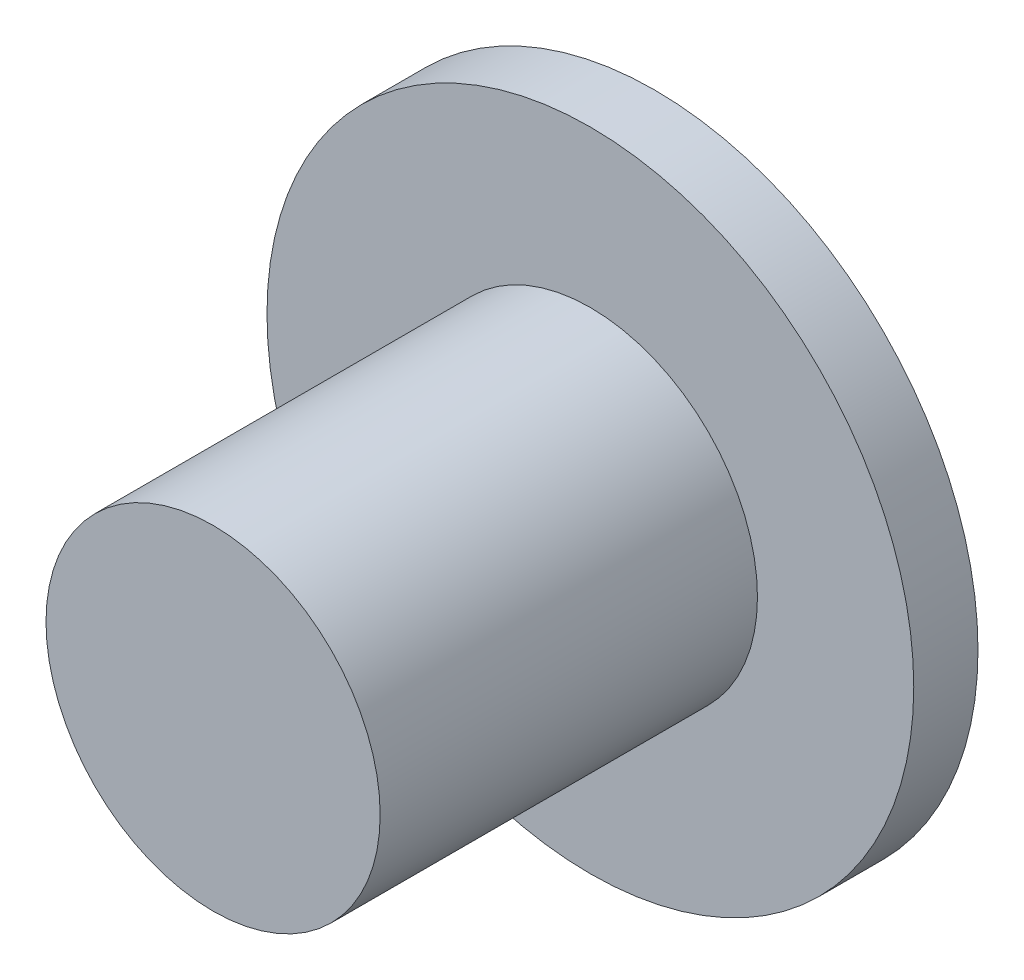
ISO-10303-21;
HEADER;
FILE_DESCRIPTION(('STEP AP214'),'2;1');
FILE_NAME('part.step','',(''),(''),'','','');
FILE_SCHEMA(('AUTOMOTIVE_DESIGN { 1 0 10303 214 1 1 1 1 }'));
ENDSEC;
DATA;
#1=APPLICATION_CONTEXT('core data for automotive mechanical design processes');
#2=APPLICATION_PROTOCOL_DEFINITION('international standard','automotive_design',2000,#1);
#3=PRODUCT_CONTEXT('',#1,'mechanical');
#4=PRODUCT('Part','Part','',(#3));
#5=PRODUCT_RELATED_PRODUCT_CATEGORY('part','',(#4));
#6=PRODUCT_DEFINITION_FORMATION('','',#4);
#7=PRODUCT_DEFINITION_CONTEXT('part definition',#1,'design');
#8=PRODUCT_DEFINITION('design','',#6,#7);
#9=PRODUCT_DEFINITION_SHAPE('','',#8);
#10=(LENGTH_UNIT() NAMED_UNIT(*) SI_UNIT(.MILLI.,.METRE.));
#11=(NAMED_UNIT(*) PLANE_ANGLE_UNIT() SI_UNIT($,.RADIAN.));
#12=(NAMED_UNIT(*) SI_UNIT($,.STERADIAN.) SOLID_ANGLE_UNIT());
#13=UNCERTAINTY_MEASURE_WITH_UNIT(LENGTH_MEASURE(1.E-05),#10,'distance_accuracy_value','');
#14=(GEOMETRIC_REPRESENTATION_CONTEXT(3) GLOBAL_UNCERTAINTY_ASSIGNED_CONTEXT((#13)) GLOBAL_UNIT_ASSIGNED_CONTEXT((#10,
#11,#12)) REPRESENTATION_CONTEXT('',''));
#15=CARTESIAN_POINT('',(0.,0.,0.));
#16=DIRECTION('',(0.,0.,1.));
#17=DIRECTION('',(1.,0.,0.));
#18=AXIS2_PLACEMENT_3D('',#15,#16,#17);
#19=CARTESIAN_POINT('',(0.,0.,0.2));
#20=DIRECTION('',(0.,0.,-1.));
#21=DIRECTION('',(-1.,0.,0.));
#22=AXIS2_PLACEMENT_3D('',#19,#20,#21);
#23=PLANE('',#22);
#24=CARTESIAN_POINT('',(0.,0.,0.2));
#25=DIRECTION('',(0.,0.,-1.));
#26=DIRECTION('',(-1.,0.,0.));
#27=AXIS2_PLACEMENT_3D('',#24,#25,#26);
#28=CIRCLE('',#27,1.15);
#29=CARTESIAN_POINT('',(-1.15,0.,0.2));
#30=VERTEX_POINT('',#29);
#31=EDGE_CURVE('E51',#30,#30,#28,.T.);
#32=ORIENTED_EDGE('',*,*,#31,.T.);
#33=EDGE_LOOP('',(#32));
#34=FACE_BOUND('',#33,.T.);
#35=CARTESIAN_POINT('',(0.,0.,0.2));
#36=DIRECTION('',(0.,0.,-1.));
#37=DIRECTION('',(-1.,0.,0.));
#38=AXIS2_PLACEMENT_3D('',#35,#36,#37);
#39=CIRCLE('',#38,0.85);
#40=CARTESIAN_POINT('',(-0.85,0.,0.2));
#41=VERTEX_POINT('',#40);
#42=EDGE_CURVE('E60',#41,#41,#39,.T.);
#43=ORIENTED_EDGE('',*,*,#42,.F.);
#44=EDGE_LOOP('',(#43));
#45=FACE_BOUND('',#44,.T.);
#46=ADVANCED_FACE('F30',(#34,#45),#23,.T.);
#47=CARTESIAN_POINT('',(0.,0.,1.));
#48=DIRECTION('',(0.,0.,1.));
#49=DIRECTION('',(1.,0.,0.));
#50=AXIS2_PLACEMENT_3D('',#47,#48,#49);
#51=PLANE('',#50);
#52=CARTESIAN_POINT('',(0.,0.,1.));
#53=DIRECTION('',(0.,0.,1.));
#54=DIRECTION('',(1.,0.,0.));
#55=AXIS2_PLACEMENT_3D('',#52,#53,#54);
#56=CIRCLE('',#55,3.);
#57=CARTESIAN_POINT('',(3.,0.,1.));
#58=VERTEX_POINT('',#57);
#59=EDGE_CURVE('E41',#58,#58,#56,.T.);
#60=ORIENTED_EDGE('',*,*,#59,.T.);
#61=EDGE_LOOP('',(#60));
#62=FACE_BOUND('',#61,.T.);
#63=CARTESIAN_POINT('',(0.,0.,1.));
#64=DIRECTION('',(0.,0.,1.));
#65=DIRECTION('',(1.,0.,0.));
#66=AXIS2_PLACEMENT_3D('',#63,#64,#65);
#67=CIRCLE('',#66,1.55);
#68=CARTESIAN_POINT('',(1.55,0.,1.));
#69=VERTEX_POINT('',#68);
#70=EDGE_CURVE('E48',#69,#69,#67,.T.);
#71=ORIENTED_EDGE('',*,*,#70,.F.);
#72=EDGE_LOOP('',(#71));
#73=FACE_BOUND('',#72,.T.);
#74=ADVANCED_FACE('F76',(#62,#73),#51,.T.);
#75=CARTESIAN_POINT('',(0.,0.,1.));
#76=DIRECTION('',(0.,0.,-1.));
#77=DIRECTION('',(-1.,0.,0.));
#78=AXIS2_PLACEMENT_3D('',#75,#76,#77);
#79=CYLINDRICAL_SURFACE('',#78,3.);
#80=CARTESIAN_POINT('',(0.,0.,0.404145188432737));
#81=DIRECTION('',(0.,0.,1.));
#82=DIRECTION('',(1.,0.,0.));
#83=AXIS2_PLACEMENT_3D('',#80,#81,#82);
#84=CIRCLE('',#83,3.);
#85=CARTESIAN_POINT('',(3.,0.,0.404145188432737));
#86=VERTEX_POINT('',#85);
#87=EDGE_CURVE('E37',#86,#86,#84,.T.);
#88=ORIENTED_EDGE('',*,*,#87,.T.);
#89=EDGE_LOOP('',(#88));
#90=FACE_BOUND('',#89,.T.);
#91=ORIENTED_EDGE('',*,*,#59,.F.);
#92=EDGE_LOOP('',(#91));
#93=FACE_BOUND('',#92,.T.);
#94=ADVANCED_FACE('F82',(#90,#93),#79,.T.);
#95=CARTESIAN_POINT('',(0.,0.,0.));
#96=DIRECTION('',(0.,0.,1.));
#97=DIRECTION('',(1.,0.,0.));
#98=AXIS2_PLACEMENT_3D('',#95,#96,#97);
#99=PLANE('',#98);
#100=CARTESIAN_POINT('',(0.,0.,0.));
#101=DIRECTION('',(0.,0.,-1.));
#102=DIRECTION('',(-1.,0.,0.));
#103=AXIS2_PLACEMENT_3D('',#100,#101,#102);
#104=CIRCLE('',#103,1.15);
#105=CARTESIAN_POINT('',(-1.15,0.,0.));
#106=VERTEX_POINT('',#105);
#107=EDGE_CURVE('E54',#106,#106,#104,.T.);
#108=ORIENTED_EDGE('',*,*,#107,.F.);
#109=EDGE_LOOP('',(#108));
#110=FACE_BOUND('',#109,.T.);
#111=CARTESIAN_POINT('',(0.,0.,0.));
#112=DIRECTION('',(0.,0.,1.));
#113=DIRECTION('',(1.,0.,0.));
#114=AXIS2_PLACEMENT_3D('',#111,#112,#113);
#115=CIRCLE('',#114,2.3);
#116=CARTESIAN_POINT('',(2.3,0.,0.));
#117=VERTEX_POINT('',#116);
#118=EDGE_CURVE('E10',#117,#117,#115,.F.);
#119=ORIENTED_EDGE('',*,*,#118,.T.);
#120=EDGE_LOOP('',(#119));
#121=FACE_BOUND('',#120,.T.);
#122=ADVANCED_FACE('F96',(#110,#121),#99,.F.);
#123=CARTESIAN_POINT('',(0.,0.,4.5));
#124=DIRECTION('',(0.,0.,-1.));
#125=DIRECTION('',(-1.,0.,0.));
#126=AXIS2_PLACEMENT_3D('',#123,#124,#125);
#127=CYLINDRICAL_SURFACE('',#126,1.55);
#128=CARTESIAN_POINT('',(0.,0.,4.5));
#129=DIRECTION('',(0.,0.,1.));
#130=DIRECTION('',(1.,0.,0.));
#131=AXIS2_PLACEMENT_3D('',#128,#129,#130);
#132=CIRCLE('',#131,1.55);
#133=CARTESIAN_POINT('',(1.55,0.,4.5));
#134=VERTEX_POINT('',#133);
#135=EDGE_CURVE('E45',#134,#134,#132,.T.);
#136=ORIENTED_EDGE('',*,*,#135,.F.);
#137=EDGE_LOOP('',(#136));
#138=FACE_BOUND('',#137,.T.);
#139=ORIENTED_EDGE('',*,*,#70,.T.);
#140=EDGE_LOOP('',(#139));
#141=FACE_BOUND('',#140,.T.);
#142=ADVANCED_FACE('F93',(#138,#141),#127,.T.);
#143=CARTESIAN_POINT('',(0.,0.,4.5));
#144=DIRECTION('',(0.,0.,1.));
#145=DIRECTION('',(1.,0.,0.));
#146=AXIS2_PLACEMENT_3D('',#143,#144,#145);
#147=PLANE('',#146);
#148=ORIENTED_EDGE('',*,*,#135,.T.);
#149=EDGE_LOOP('',(#148));
#150=FACE_BOUND('',#149,.T.);
#151=ADVANCED_FACE('F90',(#150),#147,.T.);
#152=CARTESIAN_POINT('',(0.,0.,0.404145188432737));
#153=DIRECTION('',(0.,0.,1.));
#154=DIRECTION('',(1.,0.,0.));
#155=AXIS2_PLACEMENT_3D('',#152,#153,#154);
#156=CONICAL_SURFACE('',#155,3.,1.0471975511966);
#157=ORIENTED_EDGE('',*,*,#118,.F.);
#158=EDGE_LOOP('',(#157));
#159=FACE_BOUND('',#158,.T.);
#160=ORIENTED_EDGE('',*,*,#87,.F.);
#161=EDGE_LOOP('',(#160));
#162=FACE_BOUND('',#161,.T.);
#163=ADVANCED_FACE('F32',(#159,#162),#156,.T.);
#164=CARTESIAN_POINT('',(0.,0.,0.2));
#165=DIRECTION('',(0.,0.,-1.));
#166=DIRECTION('',(-1.,0.,0.));
#167=AXIS2_PLACEMENT_3D('',#164,#165,#166);
#168=CYLINDRICAL_SURFACE('',#167,1.15);
#169=ORIENTED_EDGE('',*,*,#31,.F.);
#170=EDGE_LOOP('',(#169));
#171=FACE_BOUND('',#170,.T.);
#172=ORIENTED_EDGE('',*,*,#107,.T.);
#173=EDGE_LOOP('',(#172));
#174=FACE_BOUND('',#173,.T.);
#175=ADVANCED_FACE('F71',(#171,#174),#168,.F.);
#176=CARTESIAN_POINT('',(0.,0.,0.));
#177=DIRECTION('',(0.,0.,1.));
#178=DIRECTION('',(1.,0.,0.));
#179=AXIS2_PLACEMENT_3D('',#176,#177,#178);
#180=CYLINDRICAL_SURFACE('',#179,0.85);
#181=CARTESIAN_POINT('',(0.,0.,0.));
#182=DIRECTION('',(0.,0.,-1.));
#183=DIRECTION('',(-1.,0.,0.));
#184=AXIS2_PLACEMENT_3D('',#181,#182,#183);
#185=CIRCLE('',#184,0.85);
#186=CARTESIAN_POINT('',(-0.85,0.,0.));
#187=VERTEX_POINT('',#186);
#188=EDGE_CURVE('E57',#187,#187,#185,.T.);
#189=ORIENTED_EDGE('',*,*,#188,.F.);
#190=EDGE_LOOP('',(#189));
#191=FACE_BOUND('',#190,.T.);
#192=ORIENTED_EDGE('',*,*,#42,.T.);
#193=EDGE_LOOP('',(#192));
#194=FACE_BOUND('',#193,.T.);
#195=ADVANCED_FACE('F68',(#191,#194),#180,.T.);
#196=CARTESIAN_POINT('',(0.,0.,0.));
#197=DIRECTION('',(0.,0.,-1.));
#198=DIRECTION('',(-1.,0.,0.));
#199=AXIS2_PLACEMENT_3D('',#196,#197,#198);
#200=PLANE('',#199);
#201=ORIENTED_EDGE('',*,*,#188,.T.);
#202=EDGE_LOOP('',(#201));
#203=FACE_BOUND('',#202,.T.);
#204=ADVANCED_FACE('F66',(#203),#200,.T.);
#205=CLOSED_SHELL('',(#46,#74,#94,#122,#142,#151,#163,#175,#195,#204));
#206=MANIFOLD_SOLID_BREP('B2',#205);
#207=ADVANCED_BREP_SHAPE_REPRESENTATION('',(#18,#206),#14);
#208=SHAPE_DEFINITION_REPRESENTATION(#9,#207);
ENDSEC;
END-ISO-10303-21;
